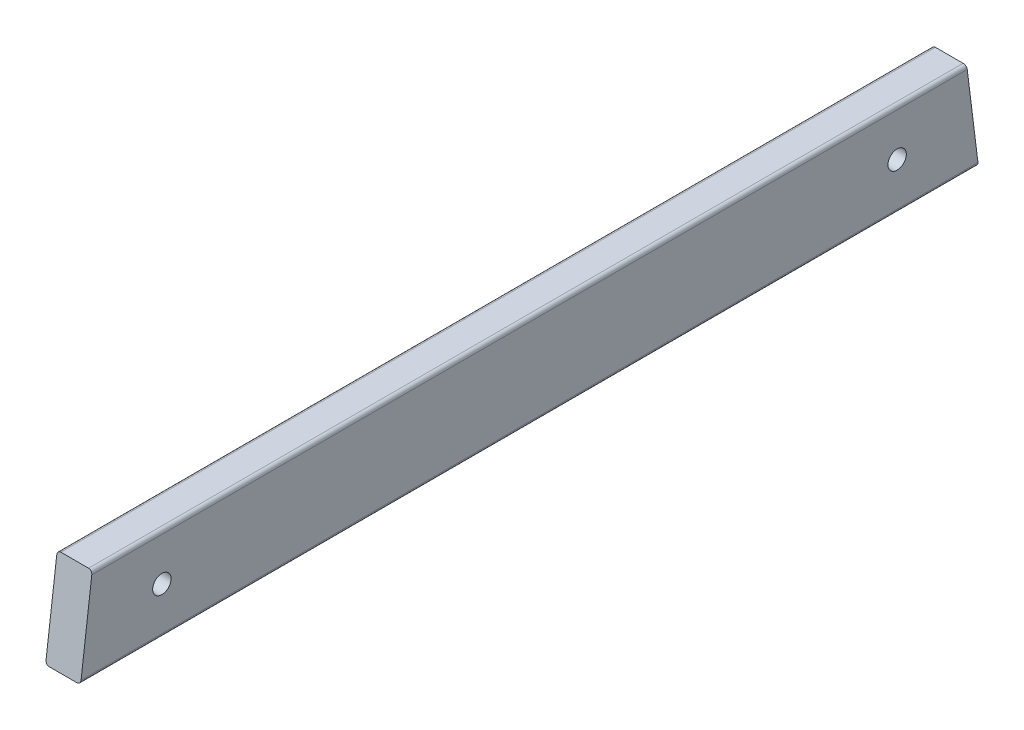
ISO-10303-21;
HEADER;
FILE_DESCRIPTION(('STEP AP214'),'2;1');
FILE_NAME('part.step','',(''),(''),'','','');
FILE_SCHEMA(('AUTOMOTIVE_DESIGN { 1 0 10303 214 1 1 1 1 }'));
ENDSEC;
DATA;
#1=APPLICATION_CONTEXT('core data for automotive mechanical design processes');
#2=APPLICATION_PROTOCOL_DEFINITION('international standard','automotive_design',2000,#1);
#3=PRODUCT_CONTEXT('',#1,'mechanical');
#4=PRODUCT('Part','Part','',(#3));
#5=PRODUCT_RELATED_PRODUCT_CATEGORY('part','',(#4));
#6=PRODUCT_DEFINITION_FORMATION('','',#4);
#7=PRODUCT_DEFINITION_CONTEXT('part definition',#1,'design');
#8=PRODUCT_DEFINITION('design','',#6,#7);
#9=PRODUCT_DEFINITION_SHAPE('','',#8);
#10=(LENGTH_UNIT() NAMED_UNIT(*) SI_UNIT(.MILLI.,.METRE.));
#11=(NAMED_UNIT(*) PLANE_ANGLE_UNIT() SI_UNIT($,.RADIAN.));
#12=(NAMED_UNIT(*) SI_UNIT($,.STERADIAN.) SOLID_ANGLE_UNIT());
#13=UNCERTAINTY_MEASURE_WITH_UNIT(LENGTH_MEASURE(1.E-05),#10,'distance_accuracy_value','');
#14=(GEOMETRIC_REPRESENTATION_CONTEXT(3) GLOBAL_UNCERTAINTY_ASSIGNED_CONTEXT((#13)) GLOBAL_UNIT_ASSIGNED_CONTEXT((#10,
#11,#12)) REPRESENTATION_CONTEXT('',''));
#15=CARTESIAN_POINT('',(0.,0.,0.));
#16=DIRECTION('',(0.,0.,1.));
#17=DIRECTION('',(1.,0.,0.));
#18=AXIS2_PLACEMENT_3D('',#15,#16,#17);
#19=CARTESIAN_POINT('',(4.7625,-12.7,210.));
#20=DIRECTION('',(-1.,0.,0.));
#21=DIRECTION('',(0.,0.,1.));
#22=AXIS2_PLACEMENT_3D('',#19,#20,#21);
#23=PLANE('',#22);
#24=CARTESIAN_POINT('',(4.7625,0.,-100.));
#25=DIRECTION('',(-1.,0.,0.));
#26=DIRECTION('',(0.,0.,1.));
#27=AXIS2_PLACEMENT_3D('',#24,#25,#26);
#28=CIRCLE('',#27,2.5);
#29=CARTESIAN_POINT('',(4.7625,0.,-97.5));
#30=VERTEX_POINT('',#29);
#31=EDGE_CURVE('E200',#30,#30,#28,.T.);
#32=ORIENTED_EDGE('',*,*,#31,.T.);
#33=EDGE_LOOP('',(#32));
#34=FACE_BOUND('',#33,.T.);
#35=CARTESIAN_POINT('',(4.7625,0.,100.));
#36=DIRECTION('',(-1.,0.,0.));
#37=DIRECTION('',(0.,0.,1.));
#38=AXIS2_PLACEMENT_3D('',#35,#36,#37);
#39=CIRCLE('',#38,2.5);
#40=CARTESIAN_POINT('',(4.7625,0.,102.5));
#41=VERTEX_POINT('',#40);
#42=EDGE_CURVE('E194',#41,#41,#39,.T.);
#43=ORIENTED_EDGE('',*,*,#42,.T.);
#44=EDGE_LOOP('',(#43));
#45=FACE_BOUND('',#44,.T.);
#46=DIRECTION('',(0.,-0.992292332188131,-0.12391903598979));
#47=VECTOR('',#46,1.);
#48=CARTESIAN_POINT('',(4.7625,-642.240455285288,-200.73));
#49=LINE('',#48,#47);
#50=CARTESIAN_POINT('',(4.7625,11.7,-119.064881581738));
#51=VERTEX_POINT('',#50);
#52=CARTESIAN_POINT('',(4.7625,-11.7,-121.987110594399));
#53=VERTEX_POINT('',#52);
#54=EDGE_CURVE('E112',#51,#53,#49,.T.);
#55=ORIENTED_EDGE('',*,*,#54,.F.);
#56=DIRECTION('',(0.,0.,-1.));
#57=VECTOR('',#56,1.);
#58=CARTESIAN_POINT('',(4.7625,11.7,210.));
#59=LINE('',#58,#57);
#60=CARTESIAN_POINT('',(4.7625,11.7,119.064881581738));
#61=VERTEX_POINT('',#60);
#62=EDGE_CURVE('E170',#51,#61,#59,.F.);
#63=ORIENTED_EDGE('',*,*,#62,.T.);
#64=DIRECTION('',(0.,0.992292332188131,-0.12391903598979));
#65=VECTOR('',#64,1.);
#66=CARTESIAN_POINT('',(4.7625,12.7,118.94));
#67=LINE('',#66,#65);
#68=CARTESIAN_POINT('',(4.7625,-11.7,121.987110594399));
#69=VERTEX_POINT('',#68);
#70=EDGE_CURVE('E153',#69,#61,#67,.T.);
#71=ORIENTED_EDGE('',*,*,#70,.F.);
#72=DIRECTION('',(0.,0.,-1.));
#73=VECTOR('',#72,1.);
#74=CARTESIAN_POINT('',(4.7625,-11.7,210.));
#75=LINE('',#74,#73);
#76=EDGE_CURVE('E174',#69,#53,#75,.T.);
#77=ORIENTED_EDGE('',*,*,#76,.T.);
#78=EDGE_LOOP('',(#55,#63,#71,#77));
#79=FACE_BOUND('',#78,.T.);
#80=ADVANCED_FACE('F41',(#34,#45,#79),#23,.F.);
#81=CARTESIAN_POINT('',(-4.7625,12.7,210.));
#82=DIRECTION('',(0.,-1.,0.));
#83=DIRECTION('',(0.,0.,-1.));
#84=AXIS2_PLACEMENT_3D('',#81,#82,#83);
#85=PLANE('',#84);
#86=DIRECTION('',(-1.,0.,0.));
#87=VECTOR('',#86,1.);
#88=CARTESIAN_POINT('',(4.7625,12.7,-118.94));
#89=LINE('',#88,#87);
#90=CARTESIAN_POINT('',(3.7625,12.7,-118.94));
#91=VERTEX_POINT('',#90);
#92=CARTESIAN_POINT('',(-3.7625,12.7,-118.94));
#93=VERTEX_POINT('',#92);
#94=EDGE_CURVE('E148',#91,#93,#89,.T.);
#95=ORIENTED_EDGE('',*,*,#94,.T.);
#96=DIRECTION('',(0.,0.,-1.));
#97=VECTOR('',#96,1.);
#98=CARTESIAN_POINT('',(-3.7625,12.7,210.));
#99=LINE('',#98,#97);
#100=CARTESIAN_POINT('',(-3.7625,12.7,118.94));
#101=VERTEX_POINT('',#100);
#102=EDGE_CURVE('E127',#93,#101,#99,.F.);
#103=ORIENTED_EDGE('',*,*,#102,.T.);
#104=DIRECTION('',(-1.,0.,0.));
#105=VECTOR('',#104,1.);
#106=CARTESIAN_POINT('',(4.7625,12.7,118.94));
#107=LINE('',#106,#105);
#108=CARTESIAN_POINT('',(3.7625,12.7,118.94));
#109=VERTEX_POINT('',#108);
#110=EDGE_CURVE('E63',#109,#101,#107,.T.);
#111=ORIENTED_EDGE('',*,*,#110,.F.);
#112=DIRECTION('',(0.,0.,-1.));
#113=VECTOR('',#112,1.);
#114=CARTESIAN_POINT('',(3.7625,12.7,210.));
#115=LINE('',#114,#113);
#116=EDGE_CURVE('E133',#109,#91,#115,.T.);
#117=ORIENTED_EDGE('',*,*,#116,.T.);
#118=EDGE_LOOP('',(#95,#103,#111,#117));
#119=FACE_BOUND('',#118,.T.);
#120=ADVANCED_FACE('F146',(#119),#85,.F.);
#121=CARTESIAN_POINT('',(-4.7625,-12.7,210.));
#122=DIRECTION('',(1.,0.,0.));
#123=DIRECTION('',(0.,0.,-1.));
#124=AXIS2_PLACEMENT_3D('',#121,#122,#123);
#125=PLANE('',#124);
#126=CARTESIAN_POINT('',(-4.7625,0.,-100.));
#127=DIRECTION('',(-1.,0.,0.));
#128=DIRECTION('',(0.,0.,1.));
#129=AXIS2_PLACEMENT_3D('',#126,#127,#128);
#130=CIRCLE('',#129,2.49999999999999);
#131=CARTESIAN_POINT('',(-4.7625,0.,-97.5));
#132=VERTEX_POINT('',#131);
#133=EDGE_CURVE('E205',#132,#132,#130,.T.);
#134=ORIENTED_EDGE('',*,*,#133,.F.);
#135=EDGE_LOOP('',(#134));
#136=FACE_BOUND('',#135,.T.);
#137=CARTESIAN_POINT('',(-4.7625,0.,100.));
#138=DIRECTION('',(-1.,0.,0.));
#139=DIRECTION('',(0.,0.,1.));
#140=AXIS2_PLACEMENT_3D('',#137,#138,#139);
#141=CIRCLE('',#140,2.49999999999999);
#142=CARTESIAN_POINT('',(-4.7625,0.,102.5));
#143=VERTEX_POINT('',#142);
#144=EDGE_CURVE('E196',#143,#143,#141,.T.);
#145=ORIENTED_EDGE('',*,*,#144,.F.);
#146=EDGE_LOOP('',(#145));
#147=FACE_BOUND('',#146,.T.);
#148=DIRECTION('',(0.,-0.992292332188131,-0.12391903598979));
#149=VECTOR('',#148,1.);
#150=CARTESIAN_POINT('',(-4.7625,-642.240455285288,-200.73));
#151=LINE('',#150,#149);
#152=CARTESIAN_POINT('',(-4.7625,11.7,-119.064881581738));
#153=VERTEX_POINT('',#152);
#154=CARTESIAN_POINT('',(-4.7625,-11.7,-121.987110594399));
#155=VERTEX_POINT('',#154);
#156=EDGE_CURVE('E56',#153,#155,#151,.T.);
#157=ORIENTED_EDGE('',*,*,#156,.T.);
#158=DIRECTION('',(0.,0.,-1.));
#159=VECTOR('',#158,1.);
#160=CARTESIAN_POINT('',(-4.7625,-11.7,210.));
#161=LINE('',#160,#159);
#162=CARTESIAN_POINT('',(-4.7625,-11.7,121.987110594399));
#163=VERTEX_POINT('',#162);
#164=EDGE_CURVE('E119',#155,#163,#161,.F.);
#165=ORIENTED_EDGE('',*,*,#164,.T.);
#166=DIRECTION('',(0.,0.992292332188131,-0.12391903598979));
#167=VECTOR('',#166,1.);
#168=CARTESIAN_POINT('',(-4.7625,12.7,118.94));
#169=LINE('',#168,#167);
#170=CARTESIAN_POINT('',(-4.7625,11.7,119.064881581738));
#171=VERTEX_POINT('',#170);
#172=EDGE_CURVE('E103',#163,#171,#169,.T.);
#173=ORIENTED_EDGE('',*,*,#172,.T.);
#174=DIRECTION('',(0.,0.,-1.));
#175=VECTOR('',#174,1.);
#176=CARTESIAN_POINT('',(-4.7625,11.7,210.));
#177=LINE('',#176,#175);
#178=EDGE_CURVE('E128',#171,#153,#177,.T.);
#179=ORIENTED_EDGE('',*,*,#178,.T.);
#180=EDGE_LOOP('',(#157,#165,#173,#179));
#181=FACE_BOUND('',#180,.T.);
#182=ADVANCED_FACE('F125',(#136,#147,#181),#125,.F.);
#183=CARTESIAN_POINT('',(-4.7625,-12.7,210.));
#184=DIRECTION('',(0.,1.,0.));
#185=DIRECTION('',(0.,0.,1.));
#186=AXIS2_PLACEMENT_3D('',#183,#184,#185);
#187=PLANE('',#186);
#188=DIRECTION('',(-1.,0.,0.));
#189=VECTOR('',#188,1.);
#190=CARTESIAN_POINT('',(-4.7625,-12.7,-122.111992176136));
#191=LINE('',#190,#189);
#192=CARTESIAN_POINT('',(3.7625,-12.7,-122.111992176136));
#193=VERTEX_POINT('',#192);
#194=CARTESIAN_POINT('',(-3.7625,-12.7,-122.111992176136));
#195=VERTEX_POINT('',#194);
#196=EDGE_CURVE('E165',#193,#195,#191,.T.);
#197=ORIENTED_EDGE('',*,*,#196,.F.);
#198=DIRECTION('',(0.,0.,-1.));
#199=VECTOR('',#198,1.);
#200=CARTESIAN_POINT('',(3.7625,-12.7,210.));
#201=LINE('',#200,#199);
#202=CARTESIAN_POINT('',(3.7625,-12.7,122.111992176136));
#203=VERTEX_POINT('',#202);
#204=EDGE_CURVE('E136',#193,#203,#201,.F.);
#205=ORIENTED_EDGE('',*,*,#204,.T.);
#206=DIRECTION('',(1.,0.,0.));
#207=VECTOR('',#206,1.);
#208=CARTESIAN_POINT('',(-4.7625,-12.7,122.111992176136));
#209=LINE('',#208,#207);
#210=CARTESIAN_POINT('',(-3.7625,-12.7,122.111992176136));
#211=VERTEX_POINT('',#210);
#212=EDGE_CURVE('E122',#211,#203,#209,.T.);
#213=ORIENTED_EDGE('',*,*,#212,.F.);
#214=DIRECTION('',(0.,0.,-1.));
#215=VECTOR('',#214,1.);
#216=CARTESIAN_POINT('',(-3.7625,-12.7,210.));
#217=LINE('',#216,#215);
#218=EDGE_CURVE('E121',#211,#195,#217,.T.);
#219=ORIENTED_EDGE('',*,*,#218,.T.);
#220=EDGE_LOOP('',(#197,#205,#213,#219));
#221=FACE_BOUND('',#220,.T.);
#222=ADVANCED_FACE('F183',(#221),#187,.F.);
#223=CARTESIAN_POINT('',(3.7625,-11.7,210.));
#224=DIRECTION('',(0.,0.,-1.));
#225=DIRECTION('',(-1.,0.,0.));
#226=AXIS2_PLACEMENT_3D('',#223,#224,#225);
#227=CYLINDRICAL_SURFACE('',#226,1.);
#228=ORIENTED_EDGE('',*,*,#204,.F.);
#229=CARTESIAN_POINT('',(3.7625,-11.7,-121.987110594399));
#230=DIRECTION('',(0.,0.12391903598979,-0.992292332188132));
#231=DIRECTION('',(0.,-0.992292332188132,-0.12391903598979));
#232=AXIS2_PLACEMENT_3D('',#229,#230,#231);
#233=ELLIPSE('',#232,1.00776753740994,1.);
#234=EDGE_CURVE('E167',#193,#53,#233,.F.);
#235=ORIENTED_EDGE('',*,*,#234,.T.);
#236=ORIENTED_EDGE('',*,*,#76,.F.);
#237=CARTESIAN_POINT('',(3.7625,-11.7,121.987110594399));
#238=DIRECTION('',(0.,0.12391903598979,0.992292332188132));
#239=DIRECTION('',(0.,0.992292332188132,-0.12391903598979));
#240=AXIS2_PLACEMENT_3D('',#237,#238,#239);
#241=ELLIPSE('',#240,1.00776753740994,1.);
#242=EDGE_CURVE('E158',#69,#203,#241,.F.);
#243=ORIENTED_EDGE('',*,*,#242,.T.);
#244=EDGE_LOOP('',(#228,#235,#236,#243));
#245=FACE_BOUND('',#244,.T.);
#246=ADVANCED_FACE('F185',(#245),#227,.T.);
#247=CARTESIAN_POINT('',(-3.7625,-11.7,210.));
#248=DIRECTION('',(0.,0.,-1.));
#249=DIRECTION('',(-1.,0.,0.));
#250=AXIS2_PLACEMENT_3D('',#247,#248,#249);
#251=CYLINDRICAL_SURFACE('',#250,1.);
#252=ORIENTED_EDGE('',*,*,#164,.F.);
#253=CARTESIAN_POINT('',(-3.7625,-11.7,-121.987110594399));
#254=DIRECTION('',(0.,0.12391903598979,-0.992292332188132));
#255=DIRECTION('',(0.,-0.992292332188132,-0.12391903598979));
#256=AXIS2_PLACEMENT_3D('',#253,#254,#255);
#257=ELLIPSE('',#256,1.00776753740994,1.);
#258=EDGE_CURVE('E163',#155,#195,#257,.F.);
#259=ORIENTED_EDGE('',*,*,#258,.T.);
#260=ORIENTED_EDGE('',*,*,#218,.F.);
#261=CARTESIAN_POINT('',(-3.7625,-11.7,121.987110594399));
#262=DIRECTION('',(0.,0.12391903598979,0.992292332188132));
#263=DIRECTION('',(0.,0.992292332188132,-0.12391903598979));
#264=AXIS2_PLACEMENT_3D('',#261,#262,#263);
#265=ELLIPSE('',#264,1.00776753740994,1.);
#266=EDGE_CURVE('E106',#211,#163,#265,.F.);
#267=ORIENTED_EDGE('',*,*,#266,.T.);
#268=EDGE_LOOP('',(#252,#259,#260,#267));
#269=FACE_BOUND('',#268,.T.);
#270=ADVANCED_FACE('F117',(#269),#251,.T.);
#271=CARTESIAN_POINT('',(3.7625,11.7,210.));
#272=DIRECTION('',(0.,0.,-1.));
#273=DIRECTION('',(-1.,0.,0.));
#274=AXIS2_PLACEMENT_3D('',#271,#272,#273);
#275=CYLINDRICAL_SURFACE('',#274,1.);
#276=ORIENTED_EDGE('',*,*,#62,.F.);
#277=CARTESIAN_POINT('',(3.7625,11.7,-119.064881581738));
#278=DIRECTION('',(0.,0.12391903598979,-0.992292332188132));
#279=DIRECTION('',(0.,-0.992292332188132,-0.12391903598979));
#280=AXIS2_PLACEMENT_3D('',#277,#278,#279);
#281=ELLIPSE('',#280,1.00776753740994,1.);
#282=EDGE_CURVE('E161',#51,#91,#281,.F.);
#283=ORIENTED_EDGE('',*,*,#282,.T.);
#284=ORIENTED_EDGE('',*,*,#116,.F.);
#285=CARTESIAN_POINT('',(3.7625,11.7,119.064881581738));
#286=DIRECTION('',(0.,0.12391903598979,0.992292332188132));
#287=DIRECTION('',(0.,0.992292332188132,-0.12391903598979));
#288=AXIS2_PLACEMENT_3D('',#285,#286,#287);
#289=ELLIPSE('',#288,1.00776753740994,1.);
#290=EDGE_CURVE('E123',#109,#61,#289,.F.);
#291=ORIENTED_EDGE('',*,*,#290,.T.);
#292=EDGE_LOOP('',(#276,#283,#284,#291));
#293=FACE_BOUND('',#292,.T.);
#294=ADVANCED_FACE('F240',(#293),#275,.T.);
#295=CARTESIAN_POINT('',(-3.7625,11.7,210.));
#296=DIRECTION('',(0.,0.,-1.));
#297=DIRECTION('',(-1.,0.,0.));
#298=AXIS2_PLACEMENT_3D('',#295,#296,#297);
#299=CYLINDRICAL_SURFACE('',#298,1.);
#300=ORIENTED_EDGE('',*,*,#102,.F.);
#301=CARTESIAN_POINT('',(-3.7625,11.7,-119.064881581738));
#302=DIRECTION('',(0.,0.12391903598979,-0.992292332188132));
#303=DIRECTION('',(0.,-0.992292332188132,-0.12391903598979));
#304=AXIS2_PLACEMENT_3D('',#301,#302,#303);
#305=ELLIPSE('',#304,1.00776753740994,1.);
#306=EDGE_CURVE('E12',#93,#153,#305,.F.);
#307=ORIENTED_EDGE('',*,*,#306,.T.);
#308=ORIENTED_EDGE('',*,*,#178,.F.);
#309=CARTESIAN_POINT('',(-3.7625,11.7,119.064881581738));
#310=DIRECTION('',(0.,0.12391903598979,0.992292332188132));
#311=DIRECTION('',(0.,0.992292332188132,-0.12391903598979));
#312=AXIS2_PLACEMENT_3D('',#309,#310,#311);
#313=ELLIPSE('',#312,1.00776753740994,1.);
#314=EDGE_CURVE('E49',#171,#101,#313,.F.);
#315=ORIENTED_EDGE('',*,*,#314,.T.);
#316=EDGE_LOOP('',(#300,#307,#308,#315));
#317=FACE_BOUND('',#316,.T.);
#318=ADVANCED_FACE('F43',(#317),#299,.T.);
#319=CARTESIAN_POINT('',(4.7625,12.7,118.94));
#320=DIRECTION('',(0.,0.12391903598979,0.992292332188132));
#321=DIRECTION('',(0.,-0.992292332188132,0.12391903598979));
#322=AXIS2_PLACEMENT_3D('',#319,#320,#321);
#323=PLANE('',#322);
#324=ORIENTED_EDGE('',*,*,#70,.T.);
#325=ORIENTED_EDGE('',*,*,#290,.F.);
#326=ORIENTED_EDGE('',*,*,#110,.T.);
#327=ORIENTED_EDGE('',*,*,#314,.F.);
#328=ORIENTED_EDGE('',*,*,#172,.F.);
#329=ORIENTED_EDGE('',*,*,#266,.F.);
#330=ORIENTED_EDGE('',*,*,#212,.T.);
#331=ORIENTED_EDGE('',*,*,#242,.F.);
#332=EDGE_LOOP('',(#324,#325,#326,#327,#328,#329,#330,#331));
#333=FACE_BOUND('',#332,.T.);
#334=ADVANCED_FACE('F105',(#333),#323,.T.);
#335=CARTESIAN_POINT('',(4.7625,-642.240455285288,-200.73));
#336=DIRECTION('',(0.,0.12391903598979,-0.992292332188132));
#337=DIRECTION('',(0.,0.992292332188132,0.12391903598979));
#338=AXIS2_PLACEMENT_3D('',#335,#336,#337);
#339=PLANE('',#338);
#340=ORIENTED_EDGE('',*,*,#196,.T.);
#341=ORIENTED_EDGE('',*,*,#258,.F.);
#342=ORIENTED_EDGE('',*,*,#156,.F.);
#343=ORIENTED_EDGE('',*,*,#306,.F.);
#344=ORIENTED_EDGE('',*,*,#94,.F.);
#345=ORIENTED_EDGE('',*,*,#282,.F.);
#346=ORIENTED_EDGE('',*,*,#54,.T.);
#347=ORIENTED_EDGE('',*,*,#234,.F.);
#348=EDGE_LOOP('',(#340,#341,#342,#343,#344,#345,#346,#347));
#349=FACE_BOUND('',#348,.T.);
#350=ADVANCED_FACE('F218',(#349),#339,.T.);
#351=CARTESIAN_POINT('',(-4.7625,0.,100.));
#352=DIRECTION('',(-1.,0.,0.));
#353=DIRECTION('',(0.,0.,1.));
#354=AXIS2_PLACEMENT_3D('',#351,#352,#353);
#355=CYLINDRICAL_SURFACE('',#354,2.49999999999999);
#356=ORIENTED_EDGE('',*,*,#42,.F.);
#357=EDGE_LOOP('',(#356));
#358=FACE_BOUND('',#357,.T.);
#359=ORIENTED_EDGE('',*,*,#144,.T.);
#360=EDGE_LOOP('',(#359));
#361=FACE_BOUND('',#360,.T.);
#362=ADVANCED_FACE('F216',(#358,#361),#355,.F.);
#363=CARTESIAN_POINT('',(-4.7625,0.,-100.));
#364=DIRECTION('',(-1.,0.,0.));
#365=DIRECTION('',(0.,0.,1.));
#366=AXIS2_PLACEMENT_3D('',#363,#364,#365);
#367=CYLINDRICAL_SURFACE('',#366,2.49999999999999);
#368=ORIENTED_EDGE('',*,*,#31,.F.);
#369=EDGE_LOOP('',(#368));
#370=FACE_BOUND('',#369,.T.);
#371=ORIENTED_EDGE('',*,*,#133,.T.);
#372=EDGE_LOOP('',(#371));
#373=FACE_BOUND('',#372,.T.);
#374=ADVANCED_FACE('F209',(#370,#373),#367,.F.);
#375=CLOSED_SHELL('',(#80,#120,#182,#222,#246,#270,#294,#318,#334,#350,#362,#374));
#376=MANIFOLD_SOLID_BREP('B2',#375);
#377=ADVANCED_BREP_SHAPE_REPRESENTATION('',(#18,#376),#14);
#378=SHAPE_DEFINITION_REPRESENTATION(#9,#377);
ENDSEC;
END-ISO-10303-21;
